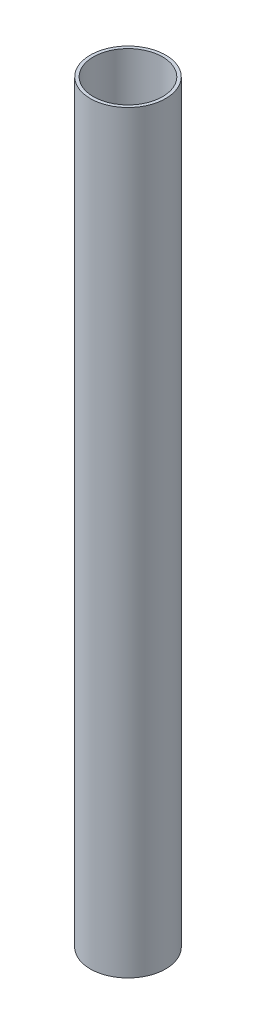
ISO-10303-21;
HEADER;
FILE_DESCRIPTION(('STEP AP214'),'2;1');
FILE_NAME('part.step','',(''),(''),'','','');
FILE_SCHEMA(('AUTOMOTIVE_DESIGN { 1 0 10303 214 1 1 1 1 }'));
ENDSEC;
DATA;
#1=APPLICATION_CONTEXT('core data for automotive mechanical design processes');
#2=APPLICATION_PROTOCOL_DEFINITION('international standard','automotive_design',2000,#1);
#3=PRODUCT_CONTEXT('',#1,'mechanical');
#4=PRODUCT('Part','Part','',(#3));
#5=PRODUCT_RELATED_PRODUCT_CATEGORY('part','',(#4));
#6=PRODUCT_DEFINITION_FORMATION('','',#4);
#7=PRODUCT_DEFINITION_CONTEXT('part definition',#1,'design');
#8=PRODUCT_DEFINITION('design','',#6,#7);
#9=PRODUCT_DEFINITION_SHAPE('','',#8);
#10=(LENGTH_UNIT() NAMED_UNIT(*) SI_UNIT(.MILLI.,.METRE.));
#11=(NAMED_UNIT(*) PLANE_ANGLE_UNIT() SI_UNIT($,.RADIAN.));
#12=(NAMED_UNIT(*) SI_UNIT($,.STERADIAN.) SOLID_ANGLE_UNIT());
#13=UNCERTAINTY_MEASURE_WITH_UNIT(LENGTH_MEASURE(1.E-05),#10,'distance_accuracy_value','');
#14=(GEOMETRIC_REPRESENTATION_CONTEXT(3) GLOBAL_UNCERTAINTY_ASSIGNED_CONTEXT((#13)) GLOBAL_UNIT_ASSIGNED_CONTEXT((#10,
#11,#12)) REPRESENTATION_CONTEXT('',''));
#15=CARTESIAN_POINT('',(0.,0.,0.));
#16=DIRECTION('',(0.,0.,1.));
#17=DIRECTION('',(1.,0.,0.));
#18=AXIS2_PLACEMENT_3D('',#15,#16,#17);
#19=CARTESIAN_POINT('',(0.,0.,0.));
#20=DIRECTION('',(0.,1.,0.));
#21=DIRECTION('',(0.,0.,1.));
#22=AXIS2_PLACEMENT_3D('',#19,#20,#21);
#23=PLANE('',#22);
#24=CARTESIAN_POINT('',(0.,0.,0.));
#25=DIRECTION('',(0.,1.,0.));
#26=DIRECTION('',(0.,0.,1.));
#27=AXIS2_PLACEMENT_3D('',#24,#25,#26);
#28=CIRCLE('',#27,27.5);
#29=CARTESIAN_POINT('',(0.,0.,27.5));
#30=VERTEX_POINT('',#29);
#31=EDGE_CURVE('E71',#30,#30,#28,.T.);
#32=ORIENTED_EDGE('',*,*,#31,.T.);
#33=EDGE_LOOP('',(#32));
#34=FACE_BOUND('',#33,.T.);
#35=CARTESIAN_POINT('',(0.,0.,0.));
#36=DIRECTION('',(0.,1.,0.));
#37=DIRECTION('',(0.,0.,1.));
#38=AXIS2_PLACEMENT_3D('',#35,#36,#37);
#39=CIRCLE('',#38,30.);
#40=CARTESIAN_POINT('',(0.,0.,30.));
#41=VERTEX_POINT('',#40);
#42=EDGE_CURVE('E53',#41,#41,#39,.T.);
#43=ORIENTED_EDGE('',*,*,#42,.F.);
#44=EDGE_LOOP('',(#43));
#45=FACE_BOUND('',#44,.T.);
#46=ADVANCED_FACE('F45',(#34,#45),#23,.F.);
#47=CARTESIAN_POINT('',(0.,600.,0.));
#48=DIRECTION('',(0.,1.,0.));
#49=DIRECTION('',(0.,0.,1.));
#50=AXIS2_PLACEMENT_3D('',#47,#48,#49);
#51=PLANE('',#50);
#52=CARTESIAN_POINT('',(0.,600.,0.));
#53=DIRECTION('',(0.,1.,0.));
#54=DIRECTION('',(0.,0.,1.));
#55=AXIS2_PLACEMENT_3D('',#52,#53,#54);
#56=CIRCLE('',#55,27.5);
#57=CARTESIAN_POINT('',(0.,600.,27.5));
#58=VERTEX_POINT('',#57);
#59=EDGE_CURVE('E68',#58,#58,#56,.T.);
#60=ORIENTED_EDGE('',*,*,#59,.F.);
#61=EDGE_LOOP('',(#60));
#62=FACE_BOUND('',#61,.T.);
#63=CARTESIAN_POINT('',(0.,600.,0.));
#64=DIRECTION('',(0.,1.,0.));
#65=DIRECTION('',(0.,0.,1.));
#66=AXIS2_PLACEMENT_3D('',#63,#64,#65);
#67=CIRCLE('',#66,30.);
#68=CARTESIAN_POINT('',(0.,600.,30.));
#69=VERTEX_POINT('',#68);
#70=EDGE_CURVE('E12',#69,#69,#67,.T.);
#71=ORIENTED_EDGE('',*,*,#70,.T.);
#72=EDGE_LOOP('',(#71));
#73=FACE_BOUND('',#72,.T.);
#74=ADVANCED_FACE('F60',(#62,#73),#51,.T.);
#75=CARTESIAN_POINT('',(0.,0.,0.));
#76=DIRECTION('',(0.,1.,0.));
#77=DIRECTION('',(0.,0.,1.));
#78=AXIS2_PLACEMENT_3D('',#75,#76,#77);
#79=CYLINDRICAL_SURFACE('',#78,30.);
#80=ORIENTED_EDGE('',*,*,#70,.F.);
#81=EDGE_LOOP('',(#80));
#82=FACE_BOUND('',#81,.T.);
#83=ORIENTED_EDGE('',*,*,#42,.T.);
#84=EDGE_LOOP('',(#83));
#85=FACE_BOUND('',#84,.T.);
#86=ADVANCED_FACE('F62',(#82,#85),#79,.T.);
#87=CARTESIAN_POINT('',(0.,0.,0.));
#88=DIRECTION('',(0.,1.,0.));
#89=DIRECTION('',(0.,0.,1.));
#90=AXIS2_PLACEMENT_3D('',#87,#88,#89);
#91=CYLINDRICAL_SURFACE('',#90,27.5);
#92=ORIENTED_EDGE('',*,*,#59,.T.);
#93=EDGE_LOOP('',(#92));
#94=FACE_BOUND('',#93,.T.);
#95=ORIENTED_EDGE('',*,*,#31,.F.);
#96=EDGE_LOOP('',(#95));
#97=FACE_BOUND('',#96,.T.);
#98=ADVANCED_FACE('F65',(#94,#97),#91,.F.);
#99=CLOSED_SHELL('',(#46,#74,#86,#98));
#100=MANIFOLD_SOLID_BREP('B2',#99);
#101=ADVANCED_BREP_SHAPE_REPRESENTATION('',(#18,#100),#14);
#102=SHAPE_DEFINITION_REPRESENTATION(#9,#101);
ENDSEC;
END-ISO-10303-21;
